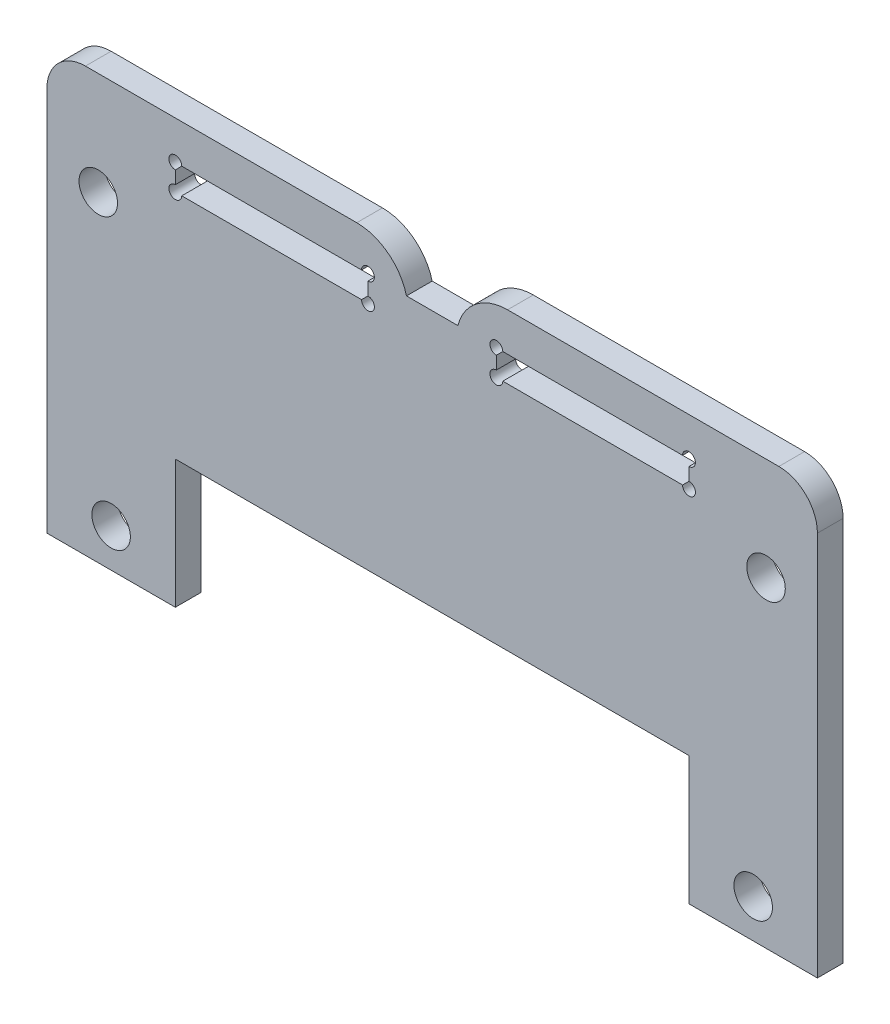
ISO-10303-21;
HEADER;
FILE_DESCRIPTION(('STEP AP214'),'2;1');
FILE_NAME('part.step','',(''),(''),'','','');
FILE_SCHEMA(('AUTOMOTIVE_DESIGN { 1 0 10303 214 1 1 1 1 }'));
ENDSEC;
DATA;
#1=APPLICATION_CONTEXT('core data for automotive mechanical design processes');
#2=APPLICATION_PROTOCOL_DEFINITION('international standard','automotive_design',2000,#1);
#3=PRODUCT_CONTEXT('',#1,'mechanical');
#4=PRODUCT('Part','Part','',(#3));
#5=PRODUCT_RELATED_PRODUCT_CATEGORY('part','',(#4));
#6=PRODUCT_DEFINITION_FORMATION('','',#4);
#7=PRODUCT_DEFINITION_CONTEXT('part definition',#1,'design');
#8=PRODUCT_DEFINITION('design','',#6,#7);
#9=PRODUCT_DEFINITION_SHAPE('','',#8);
#10=(LENGTH_UNIT() NAMED_UNIT(*) SI_UNIT(.MILLI.,.METRE.));
#11=(NAMED_UNIT(*) PLANE_ANGLE_UNIT() SI_UNIT($,.RADIAN.));
#12=(NAMED_UNIT(*) SI_UNIT($,.STERADIAN.) SOLID_ANGLE_UNIT());
#13=UNCERTAINTY_MEASURE_WITH_UNIT(LENGTH_MEASURE(1.E-05),#10,'distance_accuracy_value','');
#14=(GEOMETRIC_REPRESENTATION_CONTEXT(3) GLOBAL_UNCERTAINTY_ASSIGNED_CONTEXT((#13)) GLOBAL_UNIT_ASSIGNED_CONTEXT((#10,
#11,#12)) REPRESENTATION_CONTEXT('',''));
#15=CARTESIAN_POINT('',(0.,0.,0.));
#16=DIRECTION('',(0.,0.,1.));
#17=DIRECTION('',(1.,0.,0.));
#18=AXIS2_PLACEMENT_3D('',#15,#16,#17);
#19=CARTESIAN_POINT('',(-15.,30.,0.));
#20=DIRECTION('',(-1.,0.,0.));
#21=DIRECTION('',(0.,0.,1.));
#22=AXIS2_PLACEMENT_3D('',#19,#20,#21);
#23=PLANE('',#22);
#24=DIRECTION('',(0.,0.,1.));
#25=VECTOR('',#24,1.);
#26=CARTESIAN_POINT('',(-15.,28.5,0.));
#27=LINE('',#26,#25);
#28=CARTESIAN_POINT('',(-15.,28.5,0.));
#29=VERTEX_POINT('',#28);
#30=CARTESIAN_POINT('',(-15.,28.5,2.));
#31=VERTEX_POINT('',#30);
#32=EDGE_CURVE('E202',#29,#31,#27,.T.);
#33=ORIENTED_EDGE('',*,*,#32,.T.);
#34=DIRECTION('',(0.,1.,0.));
#35=VECTOR('',#34,1.);
#36=CARTESIAN_POINT('',(-15.,30.,2.));
#37=LINE('',#36,#35);
#38=CARTESIAN_POINT('',(-15.,29.5,2.));
#39=VERTEX_POINT('',#38);
#40=EDGE_CURVE('E189',#31,#39,#37,.T.);
#41=ORIENTED_EDGE('',*,*,#40,.T.);
#42=DIRECTION('',(0.,0.,1.));
#43=VECTOR('',#42,1.);
#44=CARTESIAN_POINT('',(-15.,29.5,0.));
#45=LINE('',#44,#43);
#46=CARTESIAN_POINT('',(-15.,29.5,0.));
#47=VERTEX_POINT('',#46);
#48=EDGE_CURVE('E200',#39,#47,#45,.F.);
#49=ORIENTED_EDGE('',*,*,#48,.T.);
#50=DIRECTION('',(0.,1.,0.));
#51=VECTOR('',#50,1.);
#52=CARTESIAN_POINT('',(-15.,30.,0.));
#53=LINE('',#52,#51);
#54=EDGE_CURVE('E204',#47,#29,#53,.F.);
#55=ORIENTED_EDGE('',*,*,#54,.T.);
#56=EDGE_LOOP('',(#33,#41,#49,#55));
#57=FACE_BOUND('',#56,.T.);
#58=ADVANCED_FACE('F17',(#57),#23,.T.);
#59=CARTESIAN_POINT('',(-40.,30.,0.));
#60=DIRECTION('',(-1.,0.,0.));
#61=DIRECTION('',(0.,-1.,0.));
#62=AXIS2_PLACEMENT_3D('',#59,#60,#61);
#63=PLANE('',#62);
#64=DIRECTION('',(0.,0.,1.));
#65=VECTOR('',#64,1.);
#66=CARTESIAN_POINT('',(-40.,28.5,0.));
#67=LINE('',#66,#65);
#68=CARTESIAN_POINT('',(-40.,28.5,0.));
#69=VERTEX_POINT('',#68);
#70=CARTESIAN_POINT('',(-40.,28.5,2.));
#71=VERTEX_POINT('',#70);
#72=EDGE_CURVE('E196',#69,#71,#67,.T.);
#73=ORIENTED_EDGE('',*,*,#72,.T.);
#74=DIRECTION('',(0.,-1.,0.));
#75=VECTOR('',#74,1.);
#76=CARTESIAN_POINT('',(-40.,30.,2.));
#77=LINE('',#76,#75);
#78=CARTESIAN_POINT('',(-40.,29.5,2.));
#79=VERTEX_POINT('',#78);
#80=EDGE_CURVE('E207',#71,#79,#77,.F.);
#81=ORIENTED_EDGE('',*,*,#80,.T.);
#82=DIRECTION('',(0.,0.,1.));
#83=VECTOR('',#82,1.);
#84=CARTESIAN_POINT('',(-40.,29.5,0.));
#85=LINE('',#84,#83);
#86=CARTESIAN_POINT('',(-40.,29.5,0.));
#87=VERTEX_POINT('',#86);
#88=EDGE_CURVE('E209',#79,#87,#85,.F.);
#89=ORIENTED_EDGE('',*,*,#88,.T.);
#90=DIRECTION('',(0.,-1.,0.));
#91=VECTOR('',#90,1.);
#92=CARTESIAN_POINT('',(-40.,30.,0.));
#93=LINE('',#92,#91);
#94=EDGE_CURVE('E203',#87,#69,#93,.T.);
#95=ORIENTED_EDGE('',*,*,#94,.T.);
#96=EDGE_LOOP('',(#73,#81,#89,#95));
#97=FACE_BOUND('',#96,.T.);
#98=ADVANCED_FACE('F516',(#97),#63,.T.);
#99=CARTESIAN_POINT('',(-15.,30.,0.));
#100=DIRECTION('',(0.,0.,1.));
#101=DIRECTION('',(1.,0.,0.));
#102=AXIS2_PLACEMENT_3D('',#99,#100,#101);
#103=CYLINDRICAL_SURFACE('',#102,0.499999999999999);
#104=CARTESIAN_POINT('',(-15.,30.,0.));
#105=DIRECTION('',(0.,0.,1.));
#106=DIRECTION('',(1.,0.,0.));
#107=AXIS2_PLACEMENT_3D('',#104,#105,#106);
#108=CIRCLE('',#107,0.499999999999999);
#109=CARTESIAN_POINT('',(-15.5,30.,0.));
#110=VERTEX_POINT('',#109);
#111=EDGE_CURVE('E179',#110,#47,#108,.F.);
#112=ORIENTED_EDGE('',*,*,#111,.T.);
#113=ORIENTED_EDGE('',*,*,#48,.F.);
#114=CARTESIAN_POINT('',(-15.,30.,2.));
#115=DIRECTION('',(0.,0.,1.));
#116=DIRECTION('',(1.,0.,0.));
#117=AXIS2_PLACEMENT_3D('',#114,#115,#116);
#118=CIRCLE('',#117,0.499999999999999);
#119=CARTESIAN_POINT('',(-15.5,30.,2.));
#120=VERTEX_POINT('',#119);
#121=EDGE_CURVE('E20',#120,#39,#118,.F.);
#122=ORIENTED_EDGE('',*,*,#121,.F.);
#123=DIRECTION('',(0.,0.,-1.));
#124=VECTOR('',#123,1.);
#125=CARTESIAN_POINT('',(-15.5,30.,0.));
#126=LINE('',#125,#124);
#127=EDGE_CURVE('E332',#110,#120,#126,.F.);
#128=ORIENTED_EDGE('',*,*,#127,.F.);
#129=EDGE_LOOP('',(#112,#113,#122,#128));
#130=FACE_BOUND('',#129,.T.);
#131=ADVANCED_FACE('F206',(#130),#103,.F.);
#132=CARTESIAN_POINT('',(-15.,28.,0.));
#133=DIRECTION('',(0.,0.,1.));
#134=DIRECTION('',(1.,0.,0.));
#135=AXIS2_PLACEMENT_3D('',#132,#133,#134);
#136=CYLINDRICAL_SURFACE('',#135,0.499999999999999);
#137=CARTESIAN_POINT('',(-15.,28.,0.));
#138=DIRECTION('',(0.,0.,1.));
#139=DIRECTION('',(1.,0.,0.));
#140=AXIS2_PLACEMENT_3D('',#137,#138,#139);
#141=CIRCLE('',#140,0.499999999999999);
#142=CARTESIAN_POINT('',(-15.5,28.,0.));
#143=VERTEX_POINT('',#142);
#144=EDGE_CURVE('E303',#29,#143,#141,.F.);
#145=ORIENTED_EDGE('',*,*,#144,.T.);
#146=DIRECTION('',(0.,0.,-1.));
#147=VECTOR('',#146,1.);
#148=CARTESIAN_POINT('',(-15.5,28.,0.));
#149=LINE('',#148,#147);
#150=CARTESIAN_POINT('',(-15.5,28.,2.));
#151=VERTEX_POINT('',#150);
#152=EDGE_CURVE('E328',#143,#151,#149,.F.);
#153=ORIENTED_EDGE('',*,*,#152,.T.);
#154=CARTESIAN_POINT('',(-15.,28.,2.));
#155=DIRECTION('',(0.,0.,1.));
#156=DIRECTION('',(1.,0.,0.));
#157=AXIS2_PLACEMENT_3D('',#154,#155,#156);
#158=CIRCLE('',#157,0.499999999999999);
#159=EDGE_CURVE('E195',#31,#151,#158,.F.);
#160=ORIENTED_EDGE('',*,*,#159,.F.);
#161=ORIENTED_EDGE('',*,*,#32,.F.);
#162=EDGE_LOOP('',(#145,#153,#160,#161));
#163=FACE_BOUND('',#162,.T.);
#164=ADVANCED_FACE('F387',(#163),#136,.F.);
#165=CARTESIAN_POINT('',(-30.,30.,0.));
#166=DIRECTION('',(-1.,0.,0.));
#167=DIRECTION('',(0.,-1.,0.));
#168=AXIS2_PLACEMENT_3D('',#165,#166,#167);
#169=PLANE('',#168);
#170=DIRECTION('',(0.,0.,1.));
#171=VECTOR('',#170,1.);
#172=CARTESIAN_POINT('',(-30.,29.5,0.));
#173=LINE('',#172,#171);
#174=CARTESIAN_POINT('',(-30.,29.5,0.));
#175=VERTEX_POINT('',#174);
#176=CARTESIAN_POINT('',(-30.,29.5,2.));
#177=VERTEX_POINT('',#176);
#178=EDGE_CURVE('E276',#175,#177,#173,.T.);
#179=ORIENTED_EDGE('',*,*,#178,.T.);
#180=DIRECTION('',(0.,-1.,0.));
#181=VECTOR('',#180,1.);
#182=CARTESIAN_POINT('',(-30.,30.,2.));
#183=LINE('',#182,#181);
#184=CARTESIAN_POINT('',(-30.,28.5,2.));
#185=VERTEX_POINT('',#184);
#186=EDGE_CURVE('E315',#185,#177,#183,.F.);
#187=ORIENTED_EDGE('',*,*,#186,.F.);
#188=DIRECTION('',(0.,0.,1.));
#189=VECTOR('',#188,1.);
#190=CARTESIAN_POINT('',(-30.,28.5,0.));
#191=LINE('',#190,#189);
#192=CARTESIAN_POINT('',(-30.,28.5,0.));
#193=VERTEX_POINT('',#192);
#194=EDGE_CURVE('E271',#185,#193,#191,.F.);
#195=ORIENTED_EDGE('',*,*,#194,.T.);
#196=DIRECTION('',(0.,1.,0.));
#197=VECTOR('',#196,1.);
#198=CARTESIAN_POINT('',(-30.,0.,0.));
#199=LINE('',#198,#197);
#200=EDGE_CURVE('E305',#193,#175,#199,.T.);
#201=ORIENTED_EDGE('',*,*,#200,.T.);
#202=EDGE_LOOP('',(#179,#187,#195,#201));
#203=FACE_BOUND('',#202,.T.);
#204=ADVANCED_FACE('F706',(#203),#169,.F.);
#205=CARTESIAN_POINT('',(-40.,30.,0.));
#206=DIRECTION('',(0.,0.,1.));
#207=DIRECTION('',(1.,0.,0.));
#208=AXIS2_PLACEMENT_3D('',#205,#206,#207);
#209=CYLINDRICAL_SURFACE('',#208,0.5);
#210=CARTESIAN_POINT('',(-40.,30.,0.));
#211=DIRECTION('',(0.,0.,1.));
#212=DIRECTION('',(1.,0.,0.));
#213=AXIS2_PLACEMENT_3D('',#210,#211,#212);
#214=CIRCLE('',#213,0.5);
#215=CARTESIAN_POINT('',(-40.5,30.,0.));
#216=VERTEX_POINT('',#215);
#217=EDGE_CURVE('E310',#216,#87,#214,.F.);
#218=ORIENTED_EDGE('',*,*,#217,.T.);
#219=ORIENTED_EDGE('',*,*,#88,.F.);
#220=CARTESIAN_POINT('',(-40.,30.,2.));
#221=DIRECTION('',(0.,0.,1.));
#222=DIRECTION('',(1.,0.,0.));
#223=AXIS2_PLACEMENT_3D('',#220,#221,#222);
#224=CIRCLE('',#223,0.5);
#225=CARTESIAN_POINT('',(-40.5,30.,2.));
#226=VERTEX_POINT('',#225);
#227=EDGE_CURVE('E314',#226,#79,#224,.F.);
#228=ORIENTED_EDGE('',*,*,#227,.F.);
#229=DIRECTION('',(0.,0.,-1.));
#230=VECTOR('',#229,1.);
#231=CARTESIAN_POINT('',(-40.5,30.,0.));
#232=LINE('',#231,#230);
#233=EDGE_CURVE('E423',#216,#226,#232,.F.);
#234=ORIENTED_EDGE('',*,*,#233,.F.);
#235=EDGE_LOOP('',(#218,#219,#228,#234));
#236=FACE_BOUND('',#235,.T.);
#237=ADVANCED_FACE('F522',(#236),#209,.F.);
#238=CARTESIAN_POINT('',(-40.,28.,0.));
#239=DIRECTION('',(0.,0.,1.));
#240=DIRECTION('',(1.,0.,0.));
#241=AXIS2_PLACEMENT_3D('',#238,#239,#240);
#242=CYLINDRICAL_SURFACE('',#241,0.5);
#243=CARTESIAN_POINT('',(-40.,28.,0.));
#244=DIRECTION('',(0.,0.,1.));
#245=DIRECTION('',(1.,0.,0.));
#246=AXIS2_PLACEMENT_3D('',#243,#244,#245);
#247=CIRCLE('',#246,0.5);
#248=CARTESIAN_POINT('',(-40.5,28.,0.));
#249=VERTEX_POINT('',#248);
#250=EDGE_CURVE('E308',#69,#249,#247,.F.);
#251=ORIENTED_EDGE('',*,*,#250,.T.);
#252=DIRECTION('',(0.,0.,-1.));
#253=VECTOR('',#252,1.);
#254=CARTESIAN_POINT('',(-40.5,28.,0.));
#255=LINE('',#254,#253);
#256=CARTESIAN_POINT('',(-40.5,28.,2.));
#257=VERTEX_POINT('',#256);
#258=EDGE_CURVE('E420',#249,#257,#255,.F.);
#259=ORIENTED_EDGE('',*,*,#258,.T.);
#260=CARTESIAN_POINT('',(-40.,28.,2.));
#261=DIRECTION('',(0.,0.,1.));
#262=DIRECTION('',(1.,0.,0.));
#263=AXIS2_PLACEMENT_3D('',#260,#261,#262);
#264=CIRCLE('',#263,0.5);
#265=EDGE_CURVE('E312',#71,#257,#264,.F.);
#266=ORIENTED_EDGE('',*,*,#265,.F.);
#267=ORIENTED_EDGE('',*,*,#72,.F.);
#268=EDGE_LOOP('',(#251,#259,#266,#267));
#269=FACE_BOUND('',#268,.T.);
#270=ADVANCED_FACE('F512',(#269),#242,.F.);
#271=CARTESIAN_POINT('',(-55.,30.,0.));
#272=DIRECTION('',(-1.,0.,0.));
#273=DIRECTION('',(0.,0.,1.));
#274=AXIS2_PLACEMENT_3D('',#271,#272,#273);
#275=PLANE('',#274);
#276=DIRECTION('',(0.,0.,1.));
#277=VECTOR('',#276,1.);
#278=CARTESIAN_POINT('',(-55.,29.5,0.));
#279=LINE('',#278,#277);
#280=CARTESIAN_POINT('',(-55.,29.5,0.));
#281=VERTEX_POINT('',#280);
#282=CARTESIAN_POINT('',(-55.,29.5,2.));
#283=VERTEX_POINT('',#282);
#284=EDGE_CURVE('E267',#281,#283,#279,.T.);
#285=ORIENTED_EDGE('',*,*,#284,.T.);
#286=DIRECTION('',(0.,1.,0.));
#287=VECTOR('',#286,1.);
#288=CARTESIAN_POINT('',(-55.,30.,2.));
#289=LINE('',#288,#287);
#290=CARTESIAN_POINT('',(-55.,28.5,2.));
#291=VERTEX_POINT('',#290);
#292=EDGE_CURVE('E35',#291,#283,#289,.T.);
#293=ORIENTED_EDGE('',*,*,#292,.F.);
#294=DIRECTION('',(0.,0.,1.));
#295=VECTOR('',#294,1.);
#296=CARTESIAN_POINT('',(-55.,28.5,0.));
#297=LINE('',#296,#295);
#298=CARTESIAN_POINT('',(-55.,28.5,0.));
#299=VERTEX_POINT('',#298);
#300=EDGE_CURVE('E262',#291,#299,#297,.F.);
#301=ORIENTED_EDGE('',*,*,#300,.T.);
#302=DIRECTION('',(0.,1.,0.));
#303=VECTOR('',#302,1.);
#304=CARTESIAN_POINT('',(-55.,0.,0.));
#305=LINE('',#304,#303);
#306=EDGE_CURVE('E307',#299,#281,#305,.T.);
#307=ORIENTED_EDGE('',*,*,#306,.T.);
#308=EDGE_LOOP('',(#285,#293,#301,#307));
#309=FACE_BOUND('',#308,.T.);
#310=ADVANCED_FACE('F535',(#309),#275,.F.);
#311=CARTESIAN_POINT('',(0.,0.,0.));
#312=DIRECTION('',(0.,0.,1.));
#313=DIRECTION('',(1.,0.,0.));
#314=AXIS2_PLACEMENT_3D('',#311,#312,#313);
#315=PLANE('',#314);
#316=CARTESIAN_POINT('',(-10.,3.,0.));
#317=DIRECTION('',(0.,0.,-1.));
#318=DIRECTION('',(-1.,0.,0.));
#319=AXIS2_PLACEMENT_3D('',#316,#317,#318);
#320=CIRCLE('',#319,1.5);
#321=CARTESIAN_POINT('',(-11.5,3.,0.));
#322=VERTEX_POINT('',#321);
#323=EDGE_CURVE('E256',#322,#322,#320,.F.);
#324=ORIENTED_EDGE('',*,*,#323,.T.);
#325=EDGE_LOOP('',(#324));
#326=FACE_BOUND('',#325,.T.);
#327=CARTESIAN_POINT('',(-60.,3.,0.));
#328=DIRECTION('',(0.,0.,-1.));
#329=DIRECTION('',(-1.,0.,0.));
#330=AXIS2_PLACEMENT_3D('',#327,#328,#329);
#331=CIRCLE('',#330,1.5);
#332=CARTESIAN_POINT('',(-61.5,3.,0.));
#333=VERTEX_POINT('',#332);
#334=EDGE_CURVE('E253',#333,#333,#331,.F.);
#335=ORIENTED_EDGE('',*,*,#334,.T.);
#336=EDGE_LOOP('',(#335));
#337=FACE_BOUND('',#336,.T.);
#338=CARTESIAN_POINT('',(-29.1270166537926,29.,0.));
#339=DIRECTION('',(0.,0.,1.));
#340=DIRECTION('',(1.,0.,0.));
#341=AXIS2_PLACEMENT_3D('',#338,#339,#340);
#342=CIRCLE('',#341,4.);
#343=CARTESIAN_POINT('',(-29.1270166537926,33.,0.));
#344=VERTEX_POINT('',#343);
#345=CARTESIAN_POINT('',(-33.,30.,0.));
#346=VERTEX_POINT('',#345);
#347=EDGE_CURVE('E298',#344,#346,#342,.T.);
#348=ORIENTED_EDGE('',*,*,#347,.F.);
#349=DIRECTION('',(1.,0.,0.));
#350=VECTOR('',#349,1.);
#351=CARTESIAN_POINT('',(-65.,33.,0.));
#352=LINE('',#351,#350);
#353=CARTESIAN_POINT('',(-8.00000000000001,33.,0.));
#354=VERTEX_POINT('',#353);
#355=EDGE_CURVE('E302',#354,#344,#352,.F.);
#356=ORIENTED_EDGE('',*,*,#355,.F.);
#357=CARTESIAN_POINT('',(-8.,30.,0.));
#358=DIRECTION('',(0.,0.,1.));
#359=DIRECTION('',(1.,0.,0.));
#360=AXIS2_PLACEMENT_3D('',#357,#358,#359);
#361=CIRCLE('',#360,3.);
#362=CARTESIAN_POINT('',(-5.,30.,0.));
#363=VERTEX_POINT('',#362);
#364=EDGE_CURVE('E284',#363,#354,#361,.T.);
#365=ORIENTED_EDGE('',*,*,#364,.F.);
#366=DIRECTION('',(0.,1.,0.));
#367=VECTOR('',#366,1.);
#368=CARTESIAN_POINT('',(-5.,0.,0.));
#369=LINE('',#368,#367);
#370=CARTESIAN_POINT('',(-5.,0.,0.));
#371=VERTEX_POINT('',#370);
#372=EDGE_CURVE('E333',#371,#363,#369,.T.);
#373=ORIENTED_EDGE('',*,*,#372,.F.);
#374=DIRECTION('',(1.,0.,0.));
#375=VECTOR('',#374,1.);
#376=CARTESIAN_POINT('',(0.,0.,0.));
#377=LINE('',#376,#375);
#378=CARTESIAN_POINT('',(-15.,0.,0.));
#379=VERTEX_POINT('',#378);
#380=EDGE_CURVE('E336',#379,#371,#377,.T.);
#381=ORIENTED_EDGE('',*,*,#380,.F.);
#382=DIRECTION('',(0.,1.,0.));
#383=VECTOR('',#382,1.);
#384=CARTESIAN_POINT('',(-15.,-10.,0.));
#385=LINE('',#384,#383);
#386=CARTESIAN_POINT('',(-15.,9.99999999999999,0.));
#387=VERTEX_POINT('',#386);
#388=EDGE_CURVE('E346',#379,#387,#385,.T.);
#389=ORIENTED_EDGE('',*,*,#388,.T.);
#390=DIRECTION('',(1.,0.,0.));
#391=VECTOR('',#390,1.);
#392=CARTESIAN_POINT('',(-55.,9.99999999999999,0.));
#393=LINE('',#392,#391);
#394=CARTESIAN_POINT('',(-55.,9.99999999999999,0.));
#395=VERTEX_POINT('',#394);
#396=EDGE_CURVE('E353',#387,#395,#393,.F.);
#397=ORIENTED_EDGE('',*,*,#396,.T.);
#398=DIRECTION('',(0.,1.,0.));
#399=VECTOR('',#398,1.);
#400=CARTESIAN_POINT('',(-55.,-10.,0.));
#401=LINE('',#400,#399);
#402=CARTESIAN_POINT('',(-55.,0.,0.));
#403=VERTEX_POINT('',#402);
#404=EDGE_CURVE('E359',#395,#403,#401,.F.);
#405=ORIENTED_EDGE('',*,*,#404,.T.);
#406=DIRECTION('',(1.,0.,0.));
#407=VECTOR('',#406,1.);
#408=CARTESIAN_POINT('',(0.,0.,0.));
#409=LINE('',#408,#407);
#410=CARTESIAN_POINT('',(-65.,0.,0.));
#411=VERTEX_POINT('',#410);
#412=EDGE_CURVE('E362',#411,#403,#409,.T.);
#413=ORIENTED_EDGE('',*,*,#412,.F.);
#414=DIRECTION('',(0.,1.,0.));
#415=VECTOR('',#414,1.);
#416=CARTESIAN_POINT('',(-65.,0.,0.));
#417=LINE('',#416,#415);
#418=CARTESIAN_POINT('',(-65.,30.,0.));
#419=VERTEX_POINT('',#418);
#420=EDGE_CURVE('E370',#411,#419,#417,.T.);
#421=ORIENTED_EDGE('',*,*,#420,.T.);
#422=CARTESIAN_POINT('',(-62.,30.,0.));
#423=DIRECTION('',(0.,0.,-1.));
#424=DIRECTION('',(-1.,0.,0.));
#425=AXIS2_PLACEMENT_3D('',#422,#423,#424);
#426=CIRCLE('',#425,3.);
#427=CARTESIAN_POINT('',(-62.,33.,0.));
#428=VERTEX_POINT('',#427);
#429=EDGE_CURVE('E289',#428,#419,#426,.F.);
#430=ORIENTED_EDGE('',*,*,#429,.F.);
#431=DIRECTION('',(1.,0.,0.));
#432=VECTOR('',#431,1.);
#433=CARTESIAN_POINT('',(-65.,33.,0.));
#434=LINE('',#433,#432);
#435=CARTESIAN_POINT('',(-40.8729833462074,33.,0.));
#436=VERTEX_POINT('',#435);
#437=EDGE_CURVE('E293',#436,#428,#434,.F.);
#438=ORIENTED_EDGE('',*,*,#437,.F.);
#439=CARTESIAN_POINT('',(-40.8729833462074,29.,0.));
#440=DIRECTION('',(0.,0.,1.));
#441=DIRECTION('',(1.,0.,0.));
#442=AXIS2_PLACEMENT_3D('',#439,#440,#441);
#443=CIRCLE('',#442,4.);
#444=CARTESIAN_POINT('',(-37.,30.,0.));
#445=VERTEX_POINT('',#444);
#446=EDGE_CURVE('E294',#445,#436,#443,.T.);
#447=ORIENTED_EDGE('',*,*,#446,.F.);
#448=DIRECTION('',(1.,0.,0.));
#449=VECTOR('',#448,1.);
#450=CARTESIAN_POINT('',(-37.,30.,0.));
#451=LINE('',#450,#449);
#452=EDGE_CURVE('E378',#445,#346,#451,.T.);
#453=ORIENTED_EDGE('',*,*,#452,.T.);
#454=EDGE_LOOP('',(#348,#356,#365,#373,#381,#389,#397,#405,#413,#421,#430,#438,#447,#453));
#455=FACE_BOUND('',#454,.T.);
#456=CARTESIAN_POINT('',(-30.,30.,0.));
#457=DIRECTION('',(0.,0.,1.));
#458=DIRECTION('',(1.,0.,0.));
#459=AXIS2_PLACEMENT_3D('',#456,#457,#458);
#460=CIRCLE('',#459,0.5);
#461=CARTESIAN_POINT('',(-29.5,30.,0.));
#462=VERTEX_POINT('',#461);
#463=EDGE_CURVE('E272',#462,#175,#460,.T.);
#464=ORIENTED_EDGE('',*,*,#463,.T.);
#465=ORIENTED_EDGE('',*,*,#200,.F.);
#466=CARTESIAN_POINT('',(-30.,28.,0.));
#467=DIRECTION('',(0.,0.,1.));
#468=DIRECTION('',(1.,0.,0.));
#469=AXIS2_PLACEMENT_3D('',#466,#467,#468);
#470=CIRCLE('',#469,0.5);
#471=CARTESIAN_POINT('',(-29.5,28.,0.));
#472=VERTEX_POINT('',#471);
#473=EDGE_CURVE('E268',#193,#472,#470,.T.);
#474=ORIENTED_EDGE('',*,*,#473,.T.);
#475=DIRECTION('',(1.,0.,0.));
#476=VECTOR('',#475,1.);
#477=CARTESIAN_POINT('',(-30.,28.,0.));
#478=LINE('',#477,#476);
#479=EDGE_CURVE('E324',#472,#143,#478,.T.);
#480=ORIENTED_EDGE('',*,*,#479,.T.);
#481=ORIENTED_EDGE('',*,*,#144,.F.);
#482=ORIENTED_EDGE('',*,*,#54,.F.);
#483=ORIENTED_EDGE('',*,*,#111,.F.);
#484=DIRECTION('',(1.,0.,0.));
#485=VECTOR('',#484,1.);
#486=CARTESIAN_POINT('',(-65.,30.,0.));
#487=LINE('',#486,#485);
#488=EDGE_CURVE('E329',#462,#110,#487,.T.);
#489=ORIENTED_EDGE('',*,*,#488,.F.);
#490=EDGE_LOOP('',(#464,#465,#474,#480,#481,#482,#483,#489));
#491=FACE_BOUND('',#490,.T.);
#492=CARTESIAN_POINT('',(-55.,30.,0.));
#493=DIRECTION('',(0.,0.,1.));
#494=DIRECTION('',(1.,0.,0.));
#495=AXIS2_PLACEMENT_3D('',#492,#493,#494);
#496=CIRCLE('',#495,0.5);
#497=CARTESIAN_POINT('',(-54.5,30.,0.));
#498=VERTEX_POINT('',#497);
#499=EDGE_CURVE('E263',#498,#281,#496,.T.);
#500=ORIENTED_EDGE('',*,*,#499,.T.);
#501=ORIENTED_EDGE('',*,*,#306,.F.);
#502=CARTESIAN_POINT('',(-55.,28.,0.));
#503=DIRECTION('',(0.,0.,1.));
#504=DIRECTION('',(1.,0.,0.));
#505=AXIS2_PLACEMENT_3D('',#502,#503,#504);
#506=CIRCLE('',#505,0.5);
#507=CARTESIAN_POINT('',(-54.5,28.,0.));
#508=VERTEX_POINT('',#507);
#509=EDGE_CURVE('E259',#299,#508,#506,.T.);
#510=ORIENTED_EDGE('',*,*,#509,.T.);
#511=DIRECTION('',(1.,0.,0.));
#512=VECTOR('',#511,1.);
#513=CARTESIAN_POINT('',(-55.,28.,0.));
#514=LINE('',#513,#512);
#515=EDGE_CURVE('E418',#508,#249,#514,.T.);
#516=ORIENTED_EDGE('',*,*,#515,.T.);
#517=ORIENTED_EDGE('',*,*,#250,.F.);
#518=ORIENTED_EDGE('',*,*,#94,.F.);
#519=ORIENTED_EDGE('',*,*,#217,.F.);
#520=DIRECTION('',(1.,0.,0.));
#521=VECTOR('',#520,1.);
#522=CARTESIAN_POINT('',(-65.,30.,0.));
#523=LINE('',#522,#521);
#524=EDGE_CURVE('E322',#498,#216,#523,.T.);
#525=ORIENTED_EDGE('',*,*,#524,.F.);
#526=EDGE_LOOP('',(#500,#501,#510,#516,#517,#518,#519,#525));
#527=FACE_BOUND('',#526,.T.);
#528=CARTESIAN_POINT('',(-9.,25.,0.));
#529=DIRECTION('',(0.,0.,1.));
#530=DIRECTION('',(1.,0.,0.));
#531=AXIS2_PLACEMENT_3D('',#528,#529,#530);
#532=CIRCLE('',#531,1.5);
#533=CARTESIAN_POINT('',(-7.5,25.,0.));
#534=VERTEX_POINT('',#533);
#535=EDGE_CURVE('E277',#534,#534,#532,.T.);
#536=ORIENTED_EDGE('',*,*,#535,.T.);
#537=EDGE_LOOP('',(#536));
#538=FACE_BOUND('',#537,.T.);
#539=CARTESIAN_POINT('',(-61.,25.,0.));
#540=DIRECTION('',(0.,0.,1.));
#541=DIRECTION('',(1.,0.,0.));
#542=AXIS2_PLACEMENT_3D('',#539,#540,#541);
#543=CIRCLE('',#542,1.5);
#544=CARTESIAN_POINT('',(-59.5,25.,0.));
#545=VERTEX_POINT('',#544);
#546=EDGE_CURVE('E280',#545,#545,#543,.T.);
#547=ORIENTED_EDGE('',*,*,#546,.T.);
#548=EDGE_LOOP('',(#547));
#549=FACE_BOUND('',#548,.T.);
#550=ADVANCED_FACE('F501',(#326,#337,#455,#491,#527,#538,#549),#315,.F.);
#551=CARTESIAN_POINT('',(-65.,33.,0.));
#552=DIRECTION('',(0.,1.,0.));
#553=DIRECTION('',(0.,0.,1.));
#554=AXIS2_PLACEMENT_3D('',#551,#552,#553);
#555=PLANE('',#554);
#556=DIRECTION('',(1.,0.,0.));
#557=VECTOR('',#556,1.);
#558=CARTESIAN_POINT('',(0.,33.,2.));
#559=LINE('',#558,#557);
#560=CARTESIAN_POINT('',(-8.00000000000001,33.,2.));
#561=VERTEX_POINT('',#560);
#562=CARTESIAN_POINT('',(-29.1270166537926,33.,2.));
#563=VERTEX_POINT('',#562);
#564=EDGE_CURVE('E252',#561,#563,#559,.F.);
#565=ORIENTED_EDGE('',*,*,#564,.F.);
#566=DIRECTION('',(0.,0.,1.));
#567=VECTOR('',#566,1.);
#568=CARTESIAN_POINT('',(-8.00000000000001,33.,0.));
#569=LINE('',#568,#567);
#570=EDGE_CURVE('E287',#354,#561,#569,.T.);
#571=ORIENTED_EDGE('',*,*,#570,.F.);
#572=ORIENTED_EDGE('',*,*,#355,.T.);
#573=DIRECTION('',(0.,0.,1.));
#574=VECTOR('',#573,1.);
#575=CARTESIAN_POINT('',(-29.1270166537926,33.,-8.));
#576=LINE('',#575,#574);
#577=EDGE_CURVE('E301',#563,#344,#576,.F.);
#578=ORIENTED_EDGE('',*,*,#577,.F.);
#579=EDGE_LOOP('',(#565,#571,#572,#578));
#580=FACE_BOUND('',#579,.T.);
#581=ADVANCED_FACE('F543',(#580),#555,.T.);
#582=CARTESIAN_POINT('',(-29.1270166537926,29.,-8.));
#583=DIRECTION('',(0.,0.,1.));
#584=DIRECTION('',(1.,0.,0.));
#585=AXIS2_PLACEMENT_3D('',#582,#583,#584);
#586=CYLINDRICAL_SURFACE('',#585,4.);
#587=CARTESIAN_POINT('',(-29.1270166537926,29.,2.));
#588=DIRECTION('',(0.,0.,1.));
#589=DIRECTION('',(1.,0.,0.));
#590=AXIS2_PLACEMENT_3D('',#587,#588,#589);
#591=CIRCLE('',#590,4.);
#592=CARTESIAN_POINT('',(-33.,30.,2.));
#593=VERTEX_POINT('',#592);
#594=EDGE_CURVE('E249',#563,#593,#591,.T.);
#595=ORIENTED_EDGE('',*,*,#594,.F.);
#596=ORIENTED_EDGE('',*,*,#577,.T.);
#597=ORIENTED_EDGE('',*,*,#347,.T.);
#598=DIRECTION('',(0.,0.,-1.));
#599=VECTOR('',#598,1.);
#600=CARTESIAN_POINT('',(-33.,30.,-8.));
#601=LINE('',#600,#599);
#602=EDGE_CURVE('E297',#346,#593,#601,.F.);
#603=ORIENTED_EDGE('',*,*,#602,.T.);
#604=EDGE_LOOP('',(#595,#596,#597,#603));
#605=FACE_BOUND('',#604,.T.);
#606=ADVANCED_FACE('F639',(#605),#586,.T.);
#607=CARTESIAN_POINT('',(-37.,30.,-8.));
#608=DIRECTION('',(0.,-1.,0.));
#609=DIRECTION('',(0.,0.,-1.));
#610=AXIS2_PLACEMENT_3D('',#607,#608,#609);
#611=PLANE('',#610);
#612=DIRECTION('',(1.,0.,0.));
#613=VECTOR('',#612,1.);
#614=CARTESIAN_POINT('',(0.,30.,2.));
#615=LINE('',#614,#613);
#616=CARTESIAN_POINT('',(-37.,30.,2.));
#617=VERTEX_POINT('',#616);
#618=EDGE_CURVE('E248',#593,#617,#615,.F.);
#619=ORIENTED_EDGE('',*,*,#618,.F.);
#620=ORIENTED_EDGE('',*,*,#602,.F.);
#621=ORIENTED_EDGE('',*,*,#452,.F.);
#622=DIRECTION('',(0.,0.,1.));
#623=VECTOR('',#622,1.);
#624=CARTESIAN_POINT('',(-37.,30.,-8.));
#625=LINE('',#624,#623);
#626=EDGE_CURVE('E296',#617,#445,#625,.F.);
#627=ORIENTED_EDGE('',*,*,#626,.F.);
#628=EDGE_LOOP('',(#619,#620,#621,#627));
#629=FACE_BOUND('',#628,.T.);
#630=ADVANCED_FACE('F635',(#629),#611,.F.);
#631=CARTESIAN_POINT('',(-40.8729833462074,29.,-8.));
#632=DIRECTION('',(0.,0.,1.));
#633=DIRECTION('',(1.,0.,0.));
#634=AXIS2_PLACEMENT_3D('',#631,#632,#633);
#635=CYLINDRICAL_SURFACE('',#634,4.);
#636=CARTESIAN_POINT('',(-40.8729833462074,29.,2.));
#637=DIRECTION('',(0.,0.,1.));
#638=DIRECTION('',(1.,0.,0.));
#639=AXIS2_PLACEMENT_3D('',#636,#637,#638);
#640=CIRCLE('',#639,4.);
#641=CARTESIAN_POINT('',(-40.8729833462074,33.,2.));
#642=VERTEX_POINT('',#641);
#643=EDGE_CURVE('E245',#617,#642,#640,.T.);
#644=ORIENTED_EDGE('',*,*,#643,.F.);
#645=ORIENTED_EDGE('',*,*,#626,.T.);
#646=ORIENTED_EDGE('',*,*,#446,.T.);
#647=DIRECTION('',(0.,0.,1.));
#648=VECTOR('',#647,1.);
#649=CARTESIAN_POINT('',(-40.8729833462074,33.,0.));
#650=LINE('',#649,#648);
#651=EDGE_CURVE('E377',#642,#436,#650,.F.);
#652=ORIENTED_EDGE('',*,*,#651,.F.);
#653=EDGE_LOOP('',(#644,#645,#646,#652));
#654=FACE_BOUND('',#653,.T.);
#655=ADVANCED_FACE('F631',(#654),#635,.T.);
#656=CARTESIAN_POINT('',(-65.,33.,0.));
#657=DIRECTION('',(0.,1.,0.));
#658=DIRECTION('',(0.,0.,1.));
#659=AXIS2_PLACEMENT_3D('',#656,#657,#658);
#660=PLANE('',#659);
#661=ORIENTED_EDGE('',*,*,#437,.T.);
#662=DIRECTION('',(0.,0.,-1.));
#663=VECTOR('',#662,1.);
#664=CARTESIAN_POINT('',(-62.,33.,0.));
#665=LINE('',#664,#663);
#666=CARTESIAN_POINT('',(-62.,33.,2.));
#667=VERTEX_POINT('',#666);
#668=EDGE_CURVE('E292',#667,#428,#665,.T.);
#669=ORIENTED_EDGE('',*,*,#668,.F.);
#670=DIRECTION('',(1.,0.,0.));
#671=VECTOR('',#670,1.);
#672=CARTESIAN_POINT('',(0.,33.,2.));
#673=LINE('',#672,#671);
#674=EDGE_CURVE('E244',#642,#667,#673,.F.);
#675=ORIENTED_EDGE('',*,*,#674,.F.);
#676=ORIENTED_EDGE('',*,*,#651,.T.);
#677=EDGE_LOOP('',(#661,#669,#675,#676));
#678=FACE_BOUND('',#677,.T.);
#679=ADVANCED_FACE('F627',(#678),#660,.T.);
#680=CARTESIAN_POINT('',(-62.,30.,0.));
#681=DIRECTION('',(0.,0.,-1.));
#682=DIRECTION('',(-1.,0.,0.));
#683=AXIS2_PLACEMENT_3D('',#680,#681,#682);
#684=CYLINDRICAL_SURFACE('',#683,3.);
#685=CARTESIAN_POINT('',(-62.,30.,2.));
#686=DIRECTION('',(0.,0.,-1.));
#687=DIRECTION('',(-1.,0.,0.));
#688=AXIS2_PLACEMENT_3D('',#685,#686,#687);
#689=CIRCLE('',#688,3.);
#690=CARTESIAN_POINT('',(-65.,30.,2.));
#691=VERTEX_POINT('',#690);
#692=EDGE_CURVE('E240',#667,#691,#689,.F.);
#693=ORIENTED_EDGE('',*,*,#692,.F.);
#694=ORIENTED_EDGE('',*,*,#668,.T.);
#695=ORIENTED_EDGE('',*,*,#429,.T.);
#696=DIRECTION('',(0.,0.,-1.));
#697=VECTOR('',#696,1.);
#698=CARTESIAN_POINT('',(-65.,30.,0.));
#699=LINE('',#698,#697);
#700=EDGE_CURVE('E372',#419,#691,#699,.F.);
#701=ORIENTED_EDGE('',*,*,#700,.T.);
#702=EDGE_LOOP('',(#693,#694,#695,#701));
#703=FACE_BOUND('',#702,.T.);
#704=ADVANCED_FACE('F623',(#703),#684,.T.);
#705=CARTESIAN_POINT('',(-65.,0.,0.));
#706=DIRECTION('',(1.,0.,0.));
#707=DIRECTION('',(0.,0.,-1.));
#708=AXIS2_PLACEMENT_3D('',#705,#706,#707);
#709=PLANE('',#708);
#710=ORIENTED_EDGE('',*,*,#700,.F.);
#711=ORIENTED_EDGE('',*,*,#420,.F.);
#712=DIRECTION('',(0.,0.,-1.));
#713=VECTOR('',#712,1.);
#714=CARTESIAN_POINT('',(-65.,0.,2.));
#715=LINE('',#714,#713);
#716=CARTESIAN_POINT('',(-65.,0.,2.));
#717=VERTEX_POINT('',#716);
#718=EDGE_CURVE('E367',#717,#411,#715,.T.);
#719=ORIENTED_EDGE('',*,*,#718,.F.);
#720=DIRECTION('',(0.,1.,0.));
#721=VECTOR('',#720,1.);
#722=CARTESIAN_POINT('',(-65.,0.,2.));
#723=LINE('',#722,#721);
#724=EDGE_CURVE('E243',#691,#717,#723,.F.);
#725=ORIENTED_EDGE('',*,*,#724,.F.);
#726=EDGE_LOOP('',(#710,#711,#719,#725));
#727=FACE_BOUND('',#726,.T.);
#728=ADVANCED_FACE('F619',(#727),#709,.F.);
#729=CARTESIAN_POINT('',(0.,0.,2.));
#730=DIRECTION('',(0.,-1.,0.));
#731=DIRECTION('',(0.,0.,-1.));
#732=AXIS2_PLACEMENT_3D('',#729,#730,#731);
#733=PLANE('',#732);
#734=ORIENTED_EDGE('',*,*,#718,.T.);
#735=ORIENTED_EDGE('',*,*,#412,.T.);
#736=DIRECTION('',(0.,0.,1.));
#737=VECTOR('',#736,1.);
#738=CARTESIAN_POINT('',(-55.,0.,-8.));
#739=LINE('',#738,#737);
#740=CARTESIAN_POINT('',(-55.,0.,2.));
#741=VERTEX_POINT('',#740);
#742=EDGE_CURVE('E356',#403,#741,#739,.T.);
#743=ORIENTED_EDGE('',*,*,#742,.T.);
#744=DIRECTION('',(1.,0.,0.));
#745=VECTOR('',#744,1.);
#746=CARTESIAN_POINT('',(0.,0.,2.));
#747=LINE('',#746,#745);
#748=EDGE_CURVE('E407',#717,#741,#747,.T.);
#749=ORIENTED_EDGE('',*,*,#748,.F.);
#750=EDGE_LOOP('',(#734,#735,#743,#749));
#751=FACE_BOUND('',#750,.T.);
#752=ADVANCED_FACE('F615',(#751),#733,.T.);
#753=CARTESIAN_POINT('',(-55.,-10.,-8.));
#754=DIRECTION('',(-1.,0.,0.));
#755=DIRECTION('',(0.,0.,1.));
#756=AXIS2_PLACEMENT_3D('',#753,#754,#755);
#757=PLANE('',#756);
#758=ORIENTED_EDGE('',*,*,#404,.F.);
#759=DIRECTION('',(0.,0.,1.));
#760=VECTOR('',#759,1.);
#761=CARTESIAN_POINT('',(-55.,9.99999999999999,-8.));
#762=LINE('',#761,#760);
#763=CARTESIAN_POINT('',(-55.,9.99999999999999,2.));
#764=VERTEX_POINT('',#763);
#765=EDGE_CURVE('E350',#395,#764,#762,.T.);
#766=ORIENTED_EDGE('',*,*,#765,.T.);
#767=DIRECTION('',(0.,1.,0.));
#768=VECTOR('',#767,1.);
#769=CARTESIAN_POINT('',(-55.,0.,2.));
#770=LINE('',#769,#768);
#771=EDGE_CURVE('E463',#741,#764,#770,.T.);
#772=ORIENTED_EDGE('',*,*,#771,.F.);
#773=ORIENTED_EDGE('',*,*,#742,.F.);
#774=EDGE_LOOP('',(#758,#766,#772,#773));
#775=FACE_BOUND('',#774,.T.);
#776=ADVANCED_FACE('F611',(#775),#757,.F.);
#777=CARTESIAN_POINT('',(-55.,9.99999999999999,-8.));
#778=DIRECTION('',(0.,1.,0.));
#779=DIRECTION('',(0.,0.,1.));
#780=AXIS2_PLACEMENT_3D('',#777,#778,#779);
#781=PLANE('',#780);
#782=DIRECTION('',(1.,0.,0.));
#783=VECTOR('',#782,1.);
#784=CARTESIAN_POINT('',(0.,9.99999999999999,2.));
#785=LINE('',#784,#783);
#786=CARTESIAN_POINT('',(-15.,9.99999999999999,2.));
#787=VERTEX_POINT('',#786);
#788=EDGE_CURVE('E454',#764,#787,#785,.T.);
#789=ORIENTED_EDGE('',*,*,#788,.F.);
#790=ORIENTED_EDGE('',*,*,#765,.F.);
#791=ORIENTED_EDGE('',*,*,#396,.F.);
#792=DIRECTION('',(0.,0.,-1.));
#793=VECTOR('',#792,1.);
#794=CARTESIAN_POINT('',(-15.,9.99999999999999,-8.));
#795=LINE('',#794,#793);
#796=EDGE_CURVE('E349',#387,#787,#795,.F.);
#797=ORIENTED_EDGE('',*,*,#796,.T.);
#798=EDGE_LOOP('',(#789,#790,#791,#797));
#799=FACE_BOUND('',#798,.T.);
#800=ADVANCED_FACE('F607',(#799),#781,.F.);
#801=CARTESIAN_POINT('',(-15.,-10.,-8.));
#802=DIRECTION('',(1.,0.,0.));
#803=DIRECTION('',(0.,0.,-1.));
#804=AXIS2_PLACEMENT_3D('',#801,#802,#803);
#805=PLANE('',#804);
#806=DIRECTION('',(0.,1.,0.));
#807=VECTOR('',#806,1.);
#808=CARTESIAN_POINT('',(-15.,0.,2.));
#809=LINE('',#808,#807);
#810=CARTESIAN_POINT('',(-15.,0.,2.));
#811=VERTEX_POINT('',#810);
#812=EDGE_CURVE('E445',#787,#811,#809,.F.);
#813=ORIENTED_EDGE('',*,*,#812,.F.);
#814=ORIENTED_EDGE('',*,*,#796,.F.);
#815=ORIENTED_EDGE('',*,*,#388,.F.);
#816=DIRECTION('',(0.,0.,-1.));
#817=VECTOR('',#816,1.);
#818=CARTESIAN_POINT('',(-15.,0.,2.));
#819=LINE('',#818,#817);
#820=EDGE_CURVE('E343',#811,#379,#819,.T.);
#821=ORIENTED_EDGE('',*,*,#820,.F.);
#822=EDGE_LOOP('',(#813,#814,#815,#821));
#823=FACE_BOUND('',#822,.T.);
#824=ADVANCED_FACE('F603',(#823),#805,.F.);
#825=CARTESIAN_POINT('',(0.,0.,2.));
#826=DIRECTION('',(0.,-1.,0.));
#827=DIRECTION('',(0.,0.,-1.));
#828=AXIS2_PLACEMENT_3D('',#825,#826,#827);
#829=PLANE('',#828);
#830=DIRECTION('',(0.,0.,-1.));
#831=VECTOR('',#830,1.);
#832=CARTESIAN_POINT('',(-5.,0.,0.));
#833=LINE('',#832,#831);
#834=CARTESIAN_POINT('',(-5.,0.,2.));
#835=VERTEX_POINT('',#834);
#836=EDGE_CURVE('E288',#835,#371,#833,.T.);
#837=ORIENTED_EDGE('',*,*,#836,.F.);
#838=DIRECTION('',(1.,0.,0.));
#839=VECTOR('',#838,1.);
#840=CARTESIAN_POINT('',(0.,0.,2.));
#841=LINE('',#840,#839);
#842=EDGE_CURVE('E402',#811,#835,#841,.T.);
#843=ORIENTED_EDGE('',*,*,#842,.F.);
#844=ORIENTED_EDGE('',*,*,#820,.T.);
#845=ORIENTED_EDGE('',*,*,#380,.T.);
#846=EDGE_LOOP('',(#837,#843,#844,#845));
#847=FACE_BOUND('',#846,.T.);
#848=ADVANCED_FACE('F599',(#847),#829,.T.);
#849=CARTESIAN_POINT('',(-5.,0.,0.));
#850=DIRECTION('',(1.,0.,0.));
#851=DIRECTION('',(0.,0.,-1.));
#852=AXIS2_PLACEMENT_3D('',#849,#850,#851);
#853=PLANE('',#852);
#854=DIRECTION('',(0.,1.,0.));
#855=VECTOR('',#854,1.);
#856=CARTESIAN_POINT('',(-5.,0.,2.));
#857=LINE('',#856,#855);
#858=CARTESIAN_POINT('',(-5.,30.,2.));
#859=VERTEX_POINT('',#858);
#860=EDGE_CURVE('E239',#835,#859,#857,.T.);
#861=ORIENTED_EDGE('',*,*,#860,.F.);
#862=ORIENTED_EDGE('',*,*,#836,.T.);
#863=ORIENTED_EDGE('',*,*,#372,.T.);
#864=DIRECTION('',(0.,0.,1.));
#865=VECTOR('',#864,1.);
#866=CARTESIAN_POINT('',(-5.,30.,0.));
#867=LINE('',#866,#865);
#868=EDGE_CURVE('E283',#859,#363,#867,.F.);
#869=ORIENTED_EDGE('',*,*,#868,.F.);
#870=EDGE_LOOP('',(#861,#862,#863,#869));
#871=FACE_BOUND('',#870,.T.);
#872=ADVANCED_FACE('F595',(#871),#853,.T.);
#873=CARTESIAN_POINT('',(-8.,30.,0.));
#874=DIRECTION('',(0.,0.,1.));
#875=DIRECTION('',(1.,0.,0.));
#876=AXIS2_PLACEMENT_3D('',#873,#874,#875);
#877=CYLINDRICAL_SURFACE('',#876,3.);
#878=CARTESIAN_POINT('',(-8.,30.,2.));
#879=DIRECTION('',(0.,0.,1.));
#880=DIRECTION('',(1.,0.,0.));
#881=AXIS2_PLACEMENT_3D('',#878,#879,#880);
#882=CIRCLE('',#881,3.);
#883=EDGE_CURVE('E236',#859,#561,#882,.T.);
#884=ORIENTED_EDGE('',*,*,#883,.F.);
#885=ORIENTED_EDGE('',*,*,#868,.T.);
#886=ORIENTED_EDGE('',*,*,#364,.T.);
#887=ORIENTED_EDGE('',*,*,#570,.T.);
#888=EDGE_LOOP('',(#884,#885,#886,#887));
#889=FACE_BOUND('',#888,.T.);
#890=ADVANCED_FACE('F591',(#889),#877,.T.);
#891=CARTESIAN_POINT('',(-61.,25.,0.));
#892=DIRECTION('',(0.,0.,1.));
#893=DIRECTION('',(1.,0.,0.));
#894=AXIS2_PLACEMENT_3D('',#891,#892,#893);
#895=CYLINDRICAL_SURFACE('',#894,1.5);
#896=CARTESIAN_POINT('',(-61.,25.,2.));
#897=DIRECTION('',(0.,0.,1.));
#898=DIRECTION('',(1.,0.,0.));
#899=AXIS2_PLACEMENT_3D('',#896,#897,#898);
#900=CIRCLE('',#899,1.5);
#901=CARTESIAN_POINT('',(-59.5,25.,2.));
#902=VERTEX_POINT('',#901);
#903=EDGE_CURVE('E233',#902,#902,#900,.F.);
#904=ORIENTED_EDGE('',*,*,#903,.F.);
#905=EDGE_LOOP('',(#904));
#906=FACE_BOUND('',#905,.T.);
#907=ORIENTED_EDGE('',*,*,#546,.F.);
#908=EDGE_LOOP('',(#907));
#909=FACE_BOUND('',#908,.T.);
#910=ADVANCED_FACE('F587',(#906,#909),#895,.F.);
#911=CARTESIAN_POINT('',(-9.,25.,0.));
#912=DIRECTION('',(0.,0.,1.));
#913=DIRECTION('',(1.,0.,0.));
#914=AXIS2_PLACEMENT_3D('',#911,#912,#913);
#915=CYLINDRICAL_SURFACE('',#914,1.5);
#916=CARTESIAN_POINT('',(-9.,25.,2.));
#917=DIRECTION('',(0.,0.,1.));
#918=DIRECTION('',(1.,0.,0.));
#919=AXIS2_PLACEMENT_3D('',#916,#917,#918);
#920=CIRCLE('',#919,1.5);
#921=CARTESIAN_POINT('',(-7.5,25.,2.));
#922=VERTEX_POINT('',#921);
#923=EDGE_CURVE('E230',#922,#922,#920,.F.);
#924=ORIENTED_EDGE('',*,*,#923,.F.);
#925=EDGE_LOOP('',(#924));
#926=FACE_BOUND('',#925,.T.);
#927=ORIENTED_EDGE('',*,*,#535,.F.);
#928=EDGE_LOOP('',(#927));
#929=FACE_BOUND('',#928,.T.);
#930=ADVANCED_FACE('F583',(#926,#929),#915,.F.);
#931=CARTESIAN_POINT('',(-30.,30.,0.));
#932=DIRECTION('',(0.,0.,1.));
#933=DIRECTION('',(1.,0.,0.));
#934=AXIS2_PLACEMENT_3D('',#931,#932,#933);
#935=CYLINDRICAL_SURFACE('',#934,0.5);
#936=DIRECTION('',(0.,0.,-1.));
#937=VECTOR('',#936,1.);
#938=CARTESIAN_POINT('',(-29.5,30.,0.));
#939=LINE('',#938,#937);
#940=CARTESIAN_POINT('',(-29.5,30.,2.));
#941=VERTEX_POINT('',#940);
#942=EDGE_CURVE('E275',#941,#462,#939,.T.);
#943=ORIENTED_EDGE('',*,*,#942,.F.);
#944=CARTESIAN_POINT('',(-30.,30.,2.));
#945=DIRECTION('',(0.,0.,1.));
#946=DIRECTION('',(1.,0.,0.));
#947=AXIS2_PLACEMENT_3D('',#944,#945,#946);
#948=CIRCLE('',#947,0.5);
#949=EDGE_CURVE('E228',#177,#941,#948,.F.);
#950=ORIENTED_EDGE('',*,*,#949,.F.);
#951=ORIENTED_EDGE('',*,*,#178,.F.);
#952=ORIENTED_EDGE('',*,*,#463,.F.);
#953=EDGE_LOOP('',(#943,#950,#951,#952));
#954=FACE_BOUND('',#953,.T.);
#955=ADVANCED_FACE('F579',(#954),#935,.F.);
#956=CARTESIAN_POINT('',(-65.,30.,0.));
#957=DIRECTION('',(0.,-1.,0.));
#958=DIRECTION('',(0.,0.,-1.));
#959=AXIS2_PLACEMENT_3D('',#956,#957,#958);
#960=PLANE('',#959);
#961=ORIENTED_EDGE('',*,*,#127,.T.);
#962=DIRECTION('',(1.,0.,0.));
#963=VECTOR('',#962,1.);
#964=CARTESIAN_POINT('',(0.,30.,2.));
#965=LINE('',#964,#963);
#966=EDGE_CURVE('E193',#941,#120,#965,.T.);
#967=ORIENTED_EDGE('',*,*,#966,.F.);
#968=ORIENTED_EDGE('',*,*,#942,.T.);
#969=ORIENTED_EDGE('',*,*,#488,.T.);
#970=EDGE_LOOP('',(#961,#967,#968,#969));
#971=FACE_BOUND('',#970,.T.);
#972=ADVANCED_FACE('F576',(#971),#960,.T.);
#973=CARTESIAN_POINT('',(-30.,28.,0.));
#974=DIRECTION('',(0.,-1.,0.));
#975=DIRECTION('',(0.,0.,-1.));
#976=AXIS2_PLACEMENT_3D('',#973,#974,#975);
#977=PLANE('',#976);
#978=DIRECTION('',(0.,0.,1.));
#979=VECTOR('',#978,1.);
#980=CARTESIAN_POINT('',(-29.5,28.,0.));
#981=LINE('',#980,#979);
#982=CARTESIAN_POINT('',(-29.5,28.,2.));
#983=VERTEX_POINT('',#982);
#984=EDGE_CURVE('E327',#472,#983,#981,.T.);
#985=ORIENTED_EDGE('',*,*,#984,.T.);
#986=DIRECTION('',(1.,0.,0.));
#987=VECTOR('',#986,1.);
#988=CARTESIAN_POINT('',(0.,28.,2.));
#989=LINE('',#988,#987);
#990=EDGE_CURVE('E227',#151,#983,#989,.F.);
#991=ORIENTED_EDGE('',*,*,#990,.F.);
#992=ORIENTED_EDGE('',*,*,#152,.F.);
#993=ORIENTED_EDGE('',*,*,#479,.F.);
#994=EDGE_LOOP('',(#985,#991,#992,#993));
#995=FACE_BOUND('',#994,.T.);
#996=ADVANCED_FACE('F392',(#995),#977,.F.);
#997=CARTESIAN_POINT('',(-30.,28.,0.));
#998=DIRECTION('',(0.,0.,1.));
#999=DIRECTION('',(1.,0.,0.));
#1000=AXIS2_PLACEMENT_3D('',#997,#998,#999);
#1001=CYLINDRICAL_SURFACE('',#1000,0.5);
#1002=ORIENTED_EDGE('',*,*,#194,.F.);
#1003=CARTESIAN_POINT('',(-30.,28.,2.));
#1004=DIRECTION('',(0.,0.,1.));
#1005=DIRECTION('',(1.,0.,0.));
#1006=AXIS2_PLACEMENT_3D('',#1003,#1004,#1005);
#1007=CIRCLE('',#1006,0.5);
#1008=EDGE_CURVE('E225',#983,#185,#1007,.F.);
#1009=ORIENTED_EDGE('',*,*,#1008,.F.);
#1010=ORIENTED_EDGE('',*,*,#984,.F.);
#1011=ORIENTED_EDGE('',*,*,#473,.F.);
#1012=EDGE_LOOP('',(#1002,#1009,#1010,#1011));
#1013=FACE_BOUND('',#1012,.T.);
#1014=ADVANCED_FACE('F570',(#1013),#1001,.F.);
#1015=CARTESIAN_POINT('',(-55.,30.,0.));
#1016=DIRECTION('',(0.,0.,1.));
#1017=DIRECTION('',(1.,0.,0.));
#1018=AXIS2_PLACEMENT_3D('',#1015,#1016,#1017);
#1019=CYLINDRICAL_SURFACE('',#1018,0.5);
#1020=DIRECTION('',(0.,0.,-1.));
#1021=VECTOR('',#1020,1.);
#1022=CARTESIAN_POINT('',(-54.5,30.,0.));
#1023=LINE('',#1022,#1021);
#1024=CARTESIAN_POINT('',(-54.5,30.,2.));
#1025=VERTEX_POINT('',#1024);
#1026=EDGE_CURVE('E266',#1025,#498,#1023,.T.);
#1027=ORIENTED_EDGE('',*,*,#1026,.F.);
#1028=CARTESIAN_POINT('',(-55.,30.,2.));
#1029=DIRECTION('',(0.,0.,1.));
#1030=DIRECTION('',(1.,0.,0.));
#1031=AXIS2_PLACEMENT_3D('',#1028,#1029,#1030);
#1032=CIRCLE('',#1031,0.5);
#1033=EDGE_CURVE('E221',#283,#1025,#1032,.F.);
#1034=ORIENTED_EDGE('',*,*,#1033,.F.);
#1035=ORIENTED_EDGE('',*,*,#284,.F.);
#1036=ORIENTED_EDGE('',*,*,#499,.F.);
#1037=EDGE_LOOP('',(#1027,#1034,#1035,#1036));
#1038=FACE_BOUND('',#1037,.T.);
#1039=ADVANCED_FACE('F529',(#1038),#1019,.F.);
#1040=CARTESIAN_POINT('',(-65.,30.,0.));
#1041=DIRECTION('',(0.,-1.,0.));
#1042=DIRECTION('',(0.,0.,-1.));
#1043=AXIS2_PLACEMENT_3D('',#1040,#1041,#1042);
#1044=PLANE('',#1043);
#1045=ORIENTED_EDGE('',*,*,#233,.T.);
#1046=DIRECTION('',(1.,0.,0.));
#1047=VECTOR('',#1046,1.);
#1048=CARTESIAN_POINT('',(0.,30.,2.));
#1049=LINE('',#1048,#1047);
#1050=EDGE_CURVE('E224',#1025,#226,#1049,.T.);
#1051=ORIENTED_EDGE('',*,*,#1050,.F.);
#1052=ORIENTED_EDGE('',*,*,#1026,.T.);
#1053=ORIENTED_EDGE('',*,*,#524,.T.);
#1054=EDGE_LOOP('',(#1045,#1051,#1052,#1053));
#1055=FACE_BOUND('',#1054,.T.);
#1056=ADVANCED_FACE('F526',(#1055),#1044,.T.);
#1057=CARTESIAN_POINT('',(-55.,28.,0.));
#1058=DIRECTION('',(0.,-1.,0.));
#1059=DIRECTION('',(0.,0.,-1.));
#1060=AXIS2_PLACEMENT_3D('',#1057,#1058,#1059);
#1061=PLANE('',#1060);
#1062=DIRECTION('',(0.,0.,1.));
#1063=VECTOR('',#1062,1.);
#1064=CARTESIAN_POINT('',(-54.5,28.,0.));
#1065=LINE('',#1064,#1063);
#1066=CARTESIAN_POINT('',(-54.5,28.,2.));
#1067=VERTEX_POINT('',#1066);
#1068=EDGE_CURVE('E416',#508,#1067,#1065,.T.);
#1069=ORIENTED_EDGE('',*,*,#1068,.T.);
#1070=DIRECTION('',(1.,0.,0.));
#1071=VECTOR('',#1070,1.);
#1072=CARTESIAN_POINT('',(0.,28.,2.));
#1073=LINE('',#1072,#1071);
#1074=EDGE_CURVE('E220',#257,#1067,#1073,.F.);
#1075=ORIENTED_EDGE('',*,*,#1074,.F.);
#1076=ORIENTED_EDGE('',*,*,#258,.F.);
#1077=ORIENTED_EDGE('',*,*,#515,.F.);
#1078=EDGE_LOOP('',(#1069,#1075,#1076,#1077));
#1079=FACE_BOUND('',#1078,.T.);
#1080=ADVANCED_FACE('F509',(#1079),#1061,.F.);
#1081=CARTESIAN_POINT('',(-55.,28.,0.));
#1082=DIRECTION('',(0.,0.,1.));
#1083=DIRECTION('',(1.,0.,0.));
#1084=AXIS2_PLACEMENT_3D('',#1081,#1082,#1083);
#1085=CYLINDRICAL_SURFACE('',#1084,0.5);
#1086=ORIENTED_EDGE('',*,*,#300,.F.);
#1087=CARTESIAN_POINT('',(-55.,28.,2.));
#1088=DIRECTION('',(0.,0.,1.));
#1089=DIRECTION('',(1.,0.,0.));
#1090=AXIS2_PLACEMENT_3D('',#1087,#1088,#1089);
#1091=CIRCLE('',#1090,0.5);
#1092=EDGE_CURVE('E217',#1067,#291,#1091,.F.);
#1093=ORIENTED_EDGE('',*,*,#1092,.F.);
#1094=ORIENTED_EDGE('',*,*,#1068,.F.);
#1095=ORIENTED_EDGE('',*,*,#509,.F.);
#1096=EDGE_LOOP('',(#1086,#1093,#1094,#1095));
#1097=FACE_BOUND('',#1096,.T.);
#1098=ADVANCED_FACE('F532',(#1097),#1085,.F.);
#1099=CARTESIAN_POINT('',(-10.,3.,2.));
#1100=DIRECTION('',(0.,0.,-1.));
#1101=DIRECTION('',(-1.,0.,0.));
#1102=AXIS2_PLACEMENT_3D('',#1099,#1100,#1101);
#1103=CYLINDRICAL_SURFACE('',#1102,1.5);
#1104=CARTESIAN_POINT('',(-10.,3.,2.));
#1105=DIRECTION('',(0.,0.,-1.));
#1106=DIRECTION('',(-1.,0.,0.));
#1107=AXIS2_PLACEMENT_3D('',#1104,#1105,#1106);
#1108=CIRCLE('',#1107,1.5);
#1109=CARTESIAN_POINT('',(-11.5,3.,2.));
#1110=VERTEX_POINT('',#1109);
#1111=EDGE_CURVE('E26',#1110,#1110,#1108,.T.);
#1112=ORIENTED_EDGE('',*,*,#1111,.F.);
#1113=EDGE_LOOP('',(#1112));
#1114=FACE_BOUND('',#1113,.T.);
#1115=ORIENTED_EDGE('',*,*,#323,.F.);
#1116=EDGE_LOOP('',(#1115));
#1117=FACE_BOUND('',#1116,.T.);
#1118=ADVANCED_FACE('F554',(#1114,#1117),#1103,.F.);
#1119=CARTESIAN_POINT('',(-60.,3.,2.));
#1120=DIRECTION('',(0.,0.,-1.));
#1121=DIRECTION('',(-1.,0.,0.));
#1122=AXIS2_PLACEMENT_3D('',#1119,#1120,#1121);
#1123=CYLINDRICAL_SURFACE('',#1122,1.5);
#1124=CARTESIAN_POINT('',(-60.,3.,2.));
#1125=DIRECTION('',(0.,0.,-1.));
#1126=DIRECTION('',(-1.,0.,0.));
#1127=AXIS2_PLACEMENT_3D('',#1124,#1125,#1126);
#1128=CIRCLE('',#1127,1.5);
#1129=CARTESIAN_POINT('',(-61.5,3.,2.));
#1130=VERTEX_POINT('',#1129);
#1131=EDGE_CURVE('E11',#1130,#1130,#1128,.T.);
#1132=ORIENTED_EDGE('',*,*,#1131,.F.);
#1133=EDGE_LOOP('',(#1132));
#1134=FACE_BOUND('',#1133,.T.);
#1135=ORIENTED_EDGE('',*,*,#334,.F.);
#1136=EDGE_LOOP('',(#1135));
#1137=FACE_BOUND('',#1136,.T.);
#1138=ADVANCED_FACE('F548',(#1134,#1137),#1123,.F.);
#1139=CARTESIAN_POINT('',(0.,0.,2.));
#1140=DIRECTION('',(0.,0.,1.));
#1141=DIRECTION('',(1.,0.,0.));
#1142=AXIS2_PLACEMENT_3D('',#1139,#1140,#1141);
#1143=PLANE('',#1142);
#1144=ORIENTED_EDGE('',*,*,#1131,.T.);
#1145=EDGE_LOOP('',(#1144));
#1146=FACE_BOUND('',#1145,.T.);
#1147=ORIENTED_EDGE('',*,*,#1111,.T.);
#1148=EDGE_LOOP('',(#1147));
#1149=FACE_BOUND('',#1148,.T.);
#1150=ORIENTED_EDGE('',*,*,#1092,.T.);
#1151=ORIENTED_EDGE('',*,*,#292,.T.);
#1152=ORIENTED_EDGE('',*,*,#1033,.T.);
#1153=ORIENTED_EDGE('',*,*,#1050,.T.);
#1154=ORIENTED_EDGE('',*,*,#227,.T.);
#1155=ORIENTED_EDGE('',*,*,#80,.F.);
#1156=ORIENTED_EDGE('',*,*,#265,.T.);
#1157=ORIENTED_EDGE('',*,*,#1074,.T.);
#1158=EDGE_LOOP('',(#1150,#1151,#1152,#1153,#1154,#1155,#1156,#1157));
#1159=FACE_BOUND('',#1158,.T.);
#1160=ORIENTED_EDGE('',*,*,#1008,.T.);
#1161=ORIENTED_EDGE('',*,*,#186,.T.);
#1162=ORIENTED_EDGE('',*,*,#949,.T.);
#1163=ORIENTED_EDGE('',*,*,#966,.T.);
#1164=ORIENTED_EDGE('',*,*,#121,.T.);
#1165=ORIENTED_EDGE('',*,*,#40,.F.);
#1166=ORIENTED_EDGE('',*,*,#159,.T.);
#1167=ORIENTED_EDGE('',*,*,#990,.T.);
#1168=EDGE_LOOP('',(#1160,#1161,#1162,#1163,#1164,#1165,#1166,#1167));
#1169=FACE_BOUND('',#1168,.T.);
#1170=ORIENTED_EDGE('',*,*,#923,.T.);
#1171=EDGE_LOOP('',(#1170));
#1172=FACE_BOUND('',#1171,.T.);
#1173=ORIENTED_EDGE('',*,*,#903,.T.);
#1174=EDGE_LOOP('',(#1173));
#1175=FACE_BOUND('',#1174,.T.);
#1176=ORIENTED_EDGE('',*,*,#860,.T.);
#1177=ORIENTED_EDGE('',*,*,#883,.T.);
#1178=ORIENTED_EDGE('',*,*,#564,.T.);
#1179=ORIENTED_EDGE('',*,*,#594,.T.);
#1180=ORIENTED_EDGE('',*,*,#618,.T.);
#1181=ORIENTED_EDGE('',*,*,#643,.T.);
#1182=ORIENTED_EDGE('',*,*,#674,.T.);
#1183=ORIENTED_EDGE('',*,*,#692,.T.);
#1184=ORIENTED_EDGE('',*,*,#724,.T.);
#1185=ORIENTED_EDGE('',*,*,#748,.T.);
#1186=ORIENTED_EDGE('',*,*,#771,.T.);
#1187=ORIENTED_EDGE('',*,*,#788,.T.);
#1188=ORIENTED_EDGE('',*,*,#812,.T.);
#1189=ORIENTED_EDGE('',*,*,#842,.T.);
#1190=EDGE_LOOP('',(#1176,#1177,#1178,#1179,#1180,#1181,#1182,#1183,#1184,#1185,#1186,#1187,
#1188,#1189));
#1191=FACE_BOUND('',#1190,.T.);
#1192=ADVANCED_FACE('F187',(#1146,#1149,#1159,#1169,#1172,#1175,#1191),#1143,.T.);
#1193=CLOSED_SHELL('',(#58,#98,#131,#164,#204,#237,#270,#310,#550,#581,#606,#630,#655,#679,#704,
#728,#752,#776,#800,#824,#848,#872,#890,#910,#930,#955,#972,#996,#1014,#1039,#1056,#1080,#1098,
#1118,#1138,#1192));
#1194=MANIFOLD_SOLID_BREP('B1',#1193);
#1195=ADVANCED_BREP_SHAPE_REPRESENTATION('',(#18,#1194),#14);
#1196=SHAPE_DEFINITION_REPRESENTATION(#9,#1195);
ENDSEC;
END-ISO-10303-21;
